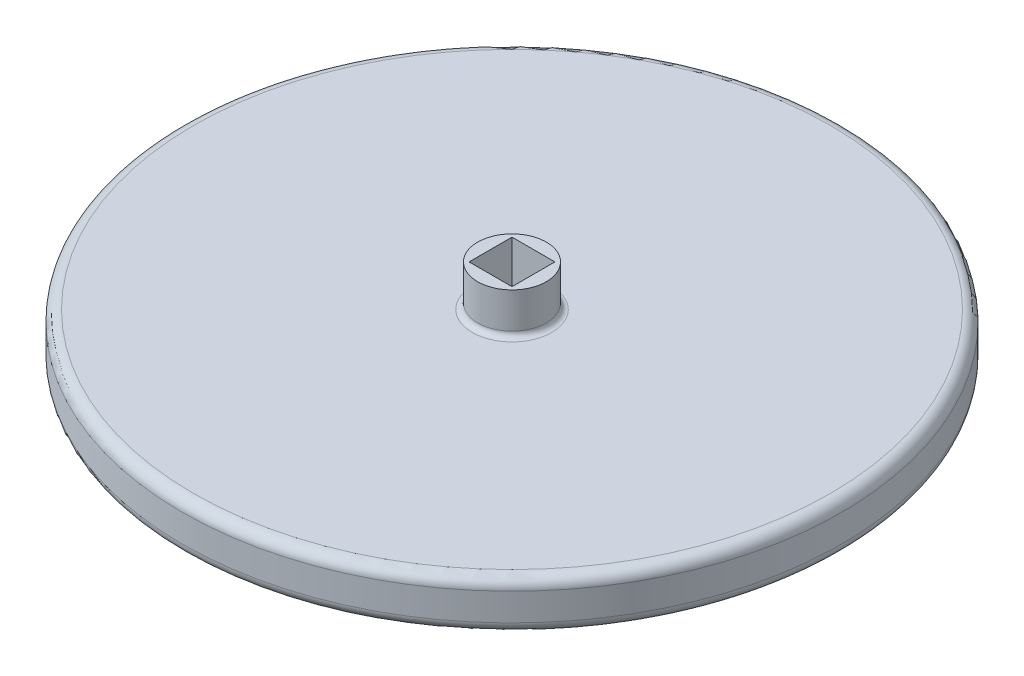
ISO-10303-21;
HEADER;
FILE_DESCRIPTION(('STEP AP214'),'2;1');
FILE_NAME('part.step','',(''),(''),'','','');
FILE_SCHEMA(('AUTOMOTIVE_DESIGN { 1 0 10303 214 1 1 1 1 }'));
ENDSEC;
DATA;
#1=APPLICATION_CONTEXT('core data for automotive mechanical design processes');
#2=APPLICATION_PROTOCOL_DEFINITION('international standard','automotive_design',2000,#1);
#3=PRODUCT_CONTEXT('',#1,'mechanical');
#4=PRODUCT('Part','Part','',(#3));
#5=PRODUCT_RELATED_PRODUCT_CATEGORY('part','',(#4));
#6=PRODUCT_DEFINITION_FORMATION('','',#4);
#7=PRODUCT_DEFINITION_CONTEXT('part definition',#1,'design');
#8=PRODUCT_DEFINITION('design','',#6,#7);
#9=PRODUCT_DEFINITION_SHAPE('','',#8);
#10=(LENGTH_UNIT() NAMED_UNIT(*) SI_UNIT(.MILLI.,.METRE.));
#11=(NAMED_UNIT(*) PLANE_ANGLE_UNIT() SI_UNIT($,.RADIAN.));
#12=(NAMED_UNIT(*) SI_UNIT($,.STERADIAN.) SOLID_ANGLE_UNIT());
#13=UNCERTAINTY_MEASURE_WITH_UNIT(LENGTH_MEASURE(1.E-05),#10,'distance_accuracy_value','');
#14=(GEOMETRIC_REPRESENTATION_CONTEXT(3) GLOBAL_UNCERTAINTY_ASSIGNED_CONTEXT((#13)) GLOBAL_UNIT_ASSIGNED_CONTEXT((#10,
#11,#12)) REPRESENTATION_CONTEXT('',''));
#15=CARTESIAN_POINT('',(0.,0.,0.));
#16=DIRECTION('',(0.,0.,1.));
#17=DIRECTION('',(1.,0.,0.));
#18=AXIS2_PLACEMENT_3D('',#15,#16,#17);
#19=CARTESIAN_POINT('',(0.,11.43,0.));
#20=DIRECTION('',(0.,-1.,0.));
#21=DIRECTION('',(0.,0.,-1.));
#22=AXIS2_PLACEMENT_3D('',#19,#20,#21);
#23=CYLINDRICAL_SURFACE('',#22,76.2);
#24=CARTESIAN_POINT('',(0.,2.54,0.));
#25=DIRECTION('',(0.,1.,0.));
#26=DIRECTION('',(0.,0.,1.));
#27=AXIS2_PLACEMENT_3D('',#24,#25,#26);
#28=CIRCLE('',#27,76.2);
#29=CARTESIAN_POINT('',(0.,2.54,76.2));
#30=VERTEX_POINT('',#29);
#31=EDGE_CURVE('E131',#30,#30,#28,.T.);
#32=ORIENTED_EDGE('',*,*,#31,.T.);
#33=EDGE_LOOP('',(#32));
#34=FACE_BOUND('',#33,.T.);
#35=CARTESIAN_POINT('',(0.,8.89,0.));
#36=DIRECTION('',(0.,1.,0.));
#37=DIRECTION('',(0.,0.,1.));
#38=AXIS2_PLACEMENT_3D('',#35,#36,#37);
#39=CIRCLE('',#38,76.2);
#40=CARTESIAN_POINT('',(0.,8.89,76.2));
#41=VERTEX_POINT('',#40);
#42=EDGE_CURVE('E128',#41,#41,#39,.F.);
#43=ORIENTED_EDGE('',*,*,#42,.T.);
#44=EDGE_LOOP('',(#43));
#45=FACE_BOUND('',#44,.T.);
#46=ADVANCED_FACE('F45',(#34,#45),#23,.T.);
#47=CARTESIAN_POINT('',(0.,11.43,0.));
#48=DIRECTION('',(0.,1.,0.));
#49=DIRECTION('',(0.,0.,1.));
#50=AXIS2_PLACEMENT_3D('',#47,#48,#49);
#51=PLANE('',#50);
#52=CARTESIAN_POINT('',(0.,11.43,0.));
#53=DIRECTION('',(0.,1.,0.));
#54=DIRECTION('',(0.,0.,1.));
#55=AXIS2_PLACEMENT_3D('',#52,#53,#54);
#56=CIRCLE('',#55,9.2075);
#57=CARTESIAN_POINT('',(0.,11.43,9.2075));
#58=VERTEX_POINT('',#57);
#59=EDGE_CURVE('E13',#58,#58,#56,.F.);
#60=ORIENTED_EDGE('',*,*,#59,.T.);
#61=EDGE_LOOP('',(#60));
#62=FACE_BOUND('',#61,.T.);
#63=CARTESIAN_POINT('',(0.,11.43,0.));
#64=DIRECTION('',(0.,1.,0.));
#65=DIRECTION('',(0.,0.,1.));
#66=AXIS2_PLACEMENT_3D('',#63,#64,#65);
#67=CIRCLE('',#66,73.66);
#68=CARTESIAN_POINT('',(0.,11.43,73.66));
#69=VERTEX_POINT('',#68);
#70=EDGE_CURVE('E137',#69,#69,#67,.T.);
#71=ORIENTED_EDGE('',*,*,#70,.T.);
#72=EDGE_LOOP('',(#71));
#73=FACE_BOUND('',#72,.T.);
#74=ADVANCED_FACE('F164',(#62,#73),#51,.T.);
#75=CARTESIAN_POINT('',(0.,0.,0.));
#76=DIRECTION('',(0.,1.,0.));
#77=DIRECTION('',(0.,0.,1.));
#78=AXIS2_PLACEMENT_3D('',#75,#76,#77);
#79=PLANE('',#78);
#80=CARTESIAN_POINT('',(0.,0.,0.));
#81=DIRECTION('',(0.,1.,0.));
#82=DIRECTION('',(0.,0.,1.));
#83=AXIS2_PLACEMENT_3D('',#80,#81,#82);
#84=CIRCLE('',#83,9.2075);
#85=CARTESIAN_POINT('',(0.,0.,9.2075));
#86=VERTEX_POINT('',#85);
#87=EDGE_CURVE('E140',#86,#86,#84,.T.);
#88=ORIENTED_EDGE('',*,*,#87,.T.);
#89=EDGE_LOOP('',(#88));
#90=FACE_BOUND('',#89,.T.);
#91=CARTESIAN_POINT('',(0.,0.,0.));
#92=DIRECTION('',(0.,1.,0.));
#93=DIRECTION('',(0.,0.,1.));
#94=AXIS2_PLACEMENT_3D('',#91,#92,#93);
#95=CIRCLE('',#94,73.66);
#96=CARTESIAN_POINT('',(0.,0.,73.66));
#97=VERTEX_POINT('',#96);
#98=EDGE_CURVE('E134',#97,#97,#95,.F.);
#99=ORIENTED_EDGE('',*,*,#98,.T.);
#100=EDGE_LOOP('',(#99));
#101=FACE_BOUND('',#100,.T.);
#102=ADVANCED_FACE('F170',(#90,#101),#79,.F.);
#103=CARTESIAN_POINT('',(0.,2.54,0.));
#104=DIRECTION('',(0.,1.,0.));
#105=DIRECTION('',(0.,0.,1.));
#106=AXIS2_PLACEMENT_3D('',#103,#104,#105);
#107=TOROIDAL_SURFACE('',#106,73.66,2.54);
#108=ORIENTED_EDGE('',*,*,#98,.F.);
#109=EDGE_LOOP('',(#108));
#110=FACE_BOUND('',#109,.T.);
#111=ORIENTED_EDGE('',*,*,#31,.F.);
#112=EDGE_LOOP('',(#111));
#113=FACE_BOUND('',#112,.T.);
#114=ADVANCED_FACE('F176',(#110,#113),#107,.T.);
#115=CARTESIAN_POINT('',(0.,8.89,0.));
#116=DIRECTION('',(0.,1.,0.));
#117=DIRECTION('',(0.,0.,1.));
#118=AXIS2_PLACEMENT_3D('',#115,#116,#117);
#119=TOROIDAL_SURFACE('',#118,73.66,2.54);
#120=ORIENTED_EDGE('',*,*,#42,.F.);
#121=EDGE_LOOP('',(#120));
#122=FACE_BOUND('',#121,.T.);
#123=ORIENTED_EDGE('',*,*,#70,.F.);
#124=EDGE_LOOP('',(#123));
#125=FACE_BOUND('',#124,.T.);
#126=ADVANCED_FACE('F179',(#122,#125),#119,.T.);
#127=CARTESIAN_POINT('',(0.,-9.525,0.));
#128=DIRECTION('',(0.,1.,0.));
#129=DIRECTION('',(0.,0.,1.));
#130=AXIS2_PLACEMENT_3D('',#127,#128,#129);
#131=PLANE('',#130);
#132=DIRECTION('',(-1.,0.,0.));
#133=VECTOR('',#132,1.);
#134=CARTESIAN_POINT('',(4.9609375,-9.525,-4.9609375));
#135=LINE('',#134,#133);
#136=CARTESIAN_POINT('',(4.9609375,-9.525,-4.9609375));
#137=VERTEX_POINT('',#136);
#138=CARTESIAN_POINT('',(-4.9609375,-9.525,-4.9609375));
#139=VERTEX_POINT('',#138);
#140=EDGE_CURVE('E115',#137,#139,#135,.T.);
#141=ORIENTED_EDGE('',*,*,#140,.T.);
#142=DIRECTION('',(0.,0.,1.));
#143=VECTOR('',#142,1.);
#144=CARTESIAN_POINT('',(-4.9609375,-9.525,4.9609375));
#145=LINE('',#144,#143);
#146=CARTESIAN_POINT('',(-4.9609375,-9.525,4.9609375));
#147=VERTEX_POINT('',#146);
#148=EDGE_CURVE('E106',#139,#147,#145,.T.);
#149=ORIENTED_EDGE('',*,*,#148,.T.);
#150=DIRECTION('',(1.,0.,0.));
#151=VECTOR('',#150,1.);
#152=CARTESIAN_POINT('',(4.9609375,-9.525,4.9609375));
#153=LINE('',#152,#151);
#154=CARTESIAN_POINT('',(4.9609375,-9.525,4.9609375));
#155=VERTEX_POINT('',#154);
#156=EDGE_CURVE('E112',#147,#155,#153,.T.);
#157=ORIENTED_EDGE('',*,*,#156,.T.);
#158=DIRECTION('',(0.,0.,-1.));
#159=VECTOR('',#158,1.);
#160=CARTESIAN_POINT('',(4.9609375,-9.525,4.9609375));
#161=LINE('',#160,#159);
#162=EDGE_CURVE('E60',#155,#137,#161,.T.);
#163=ORIENTED_EDGE('',*,*,#162,.T.);
#164=EDGE_LOOP('',(#141,#149,#157,#163));
#165=FACE_BOUND('',#164,.T.);
#166=CARTESIAN_POINT('',(0.,-9.525,0.));
#167=DIRECTION('',(0.,1.,0.));
#168=DIRECTION('',(0.,0.,1.));
#169=AXIS2_PLACEMENT_3D('',#166,#167,#168);
#170=CIRCLE('',#169,7.9375);
#171=CARTESIAN_POINT('',(0.,-9.525,7.9375));
#172=VERTEX_POINT('',#171);
#173=EDGE_CURVE('E125',#172,#172,#170,.T.);
#174=ORIENTED_EDGE('',*,*,#173,.F.);
#175=EDGE_LOOP('',(#174));
#176=FACE_BOUND('',#175,.T.);
#177=ADVANCED_FACE('F182',(#165,#176),#131,.F.);
#178=CARTESIAN_POINT('',(0.,-9.525,0.));
#179=DIRECTION('',(0.,1.,0.));
#180=DIRECTION('',(0.,0.,1.));
#181=AXIS2_PLACEMENT_3D('',#178,#179,#180);
#182=CYLINDRICAL_SURFACE('',#181,7.9375);
#183=CARTESIAN_POINT('',(0.,-1.27,0.));
#184=DIRECTION('',(0.,1.,0.));
#185=DIRECTION('',(0.,0.,1.));
#186=AXIS2_PLACEMENT_3D('',#183,#184,#185);
#187=CIRCLE('',#186,7.9375);
#188=CARTESIAN_POINT('',(0.,-1.27,7.9375));
#189=VERTEX_POINT('',#188);
#190=EDGE_CURVE('E143',#189,#189,#187,.F.);
#191=ORIENTED_EDGE('',*,*,#190,.T.);
#192=EDGE_LOOP('',(#191));
#193=FACE_BOUND('',#192,.T.);
#194=ORIENTED_EDGE('',*,*,#173,.T.);
#195=EDGE_LOOP('',(#194));
#196=FACE_BOUND('',#195,.T.);
#197=ADVANCED_FACE('F187',(#193,#196),#182,.T.);
#198=CARTESIAN_POINT('',(0.,12.7,0.));
#199=DIRECTION('',(0.,1.,0.));
#200=DIRECTION('',(0.,0.,1.));
#201=AXIS2_PLACEMENT_3D('',#198,#199,#200);
#202=CIRCLE('',#201,7.9375);
#203=CARTESIAN_POINT('',(0.,12.7,7.9375));
#204=VERTEX_POINT('',#203);
#205=EDGE_CURVE('E53',#204,#204,#202,.T.);
#206=ORIENTED_EDGE('',*,*,#205,.T.);
#207=EDGE_LOOP('',(#206));
#208=FACE_BOUND('',#207,.T.);
#209=CARTESIAN_POINT('',(0.,20.955,0.));
#210=DIRECTION('',(0.,1.,0.));
#211=DIRECTION('',(0.,0.,1.));
#212=AXIS2_PLACEMENT_3D('',#209,#210,#211);
#213=CIRCLE('',#212,7.9375);
#214=CARTESIAN_POINT('',(0.,20.955,7.9375));
#215=VERTEX_POINT('',#214);
#216=EDGE_CURVE('E120',#215,#215,#213,.T.);
#217=ORIENTED_EDGE('',*,*,#216,.F.);
#218=EDGE_LOOP('',(#217));
#219=FACE_BOUND('',#218,.T.);
#220=ADVANCED_FACE('F148',(#208,#219),#182,.T.);
#221=CARTESIAN_POINT('',(0.,20.955,0.));
#222=DIRECTION('',(0.,1.,0.));
#223=DIRECTION('',(0.,0.,1.));
#224=AXIS2_PLACEMENT_3D('',#221,#222,#223);
#225=PLANE('',#224);
#226=DIRECTION('',(0.,0.,1.));
#227=VECTOR('',#226,1.);
#228=CARTESIAN_POINT('',(-4.9609375,20.955,4.9609375));
#229=LINE('',#228,#227);
#230=CARTESIAN_POINT('',(-4.9609375,20.955,-4.9609375));
#231=VERTEX_POINT('',#230);
#232=CARTESIAN_POINT('',(-4.9609375,20.955,4.9609375));
#233=VERTEX_POINT('',#232);
#234=EDGE_CURVE('E68',#231,#233,#229,.T.);
#235=ORIENTED_EDGE('',*,*,#234,.F.);
#236=DIRECTION('',(-1.,0.,0.));
#237=VECTOR('',#236,1.);
#238=CARTESIAN_POINT('',(4.9609375,20.955,-4.9609375));
#239=LINE('',#238,#237);
#240=CARTESIAN_POINT('',(4.9609375,20.955,-4.9609375));
#241=VERTEX_POINT('',#240);
#242=EDGE_CURVE('E104',#241,#231,#239,.T.);
#243=ORIENTED_EDGE('',*,*,#242,.F.);
#244=DIRECTION('',(0.,0.,-1.));
#245=VECTOR('',#244,1.);
#246=CARTESIAN_POINT('',(4.9609375,20.955,4.9609375));
#247=LINE('',#246,#245);
#248=CARTESIAN_POINT('',(4.9609375,20.955,4.9609375));
#249=VERTEX_POINT('',#248);
#250=EDGE_CURVE('E88',#249,#241,#247,.T.);
#251=ORIENTED_EDGE('',*,*,#250,.F.);
#252=DIRECTION('',(1.,0.,0.));
#253=VECTOR('',#252,1.);
#254=CARTESIAN_POINT('',(4.9609375,20.955,4.9609375));
#255=LINE('',#254,#253);
#256=EDGE_CURVE('E97',#233,#249,#255,.T.);
#257=ORIENTED_EDGE('',*,*,#256,.F.);
#258=EDGE_LOOP('',(#235,#243,#251,#257));
#259=FACE_BOUND('',#258,.T.);
#260=ORIENTED_EDGE('',*,*,#216,.T.);
#261=EDGE_LOOP('',(#260));
#262=FACE_BOUND('',#261,.T.);
#263=ADVANCED_FACE('F101',(#259,#262),#225,.T.);
#264=CARTESIAN_POINT('',(0.,-1.27,0.));
#265=DIRECTION('',(0.,1.,0.));
#266=DIRECTION('',(0.,0.,1.));
#267=AXIS2_PLACEMENT_3D('',#264,#265,#266);
#268=TOROIDAL_SURFACE('',#267,9.2075,1.27);
#269=ORIENTED_EDGE('',*,*,#190,.F.);
#270=EDGE_LOOP('',(#269));
#271=FACE_BOUND('',#270,.T.);
#272=ORIENTED_EDGE('',*,*,#87,.F.);
#273=EDGE_LOOP('',(#272));
#274=FACE_BOUND('',#273,.T.);
#275=ADVANCED_FACE('F153',(#271,#274),#268,.F.);
#276=CARTESIAN_POINT('',(0.,12.7,0.));
#277=DIRECTION('',(0.,1.,0.));
#278=DIRECTION('',(0.,0.,1.));
#279=AXIS2_PLACEMENT_3D('',#276,#277,#278);
#280=TOROIDAL_SURFACE('',#279,9.2075,1.27);
#281=ORIENTED_EDGE('',*,*,#59,.F.);
#282=EDGE_LOOP('',(#281));
#283=FACE_BOUND('',#282,.T.);
#284=ORIENTED_EDGE('',*,*,#205,.F.);
#285=EDGE_LOOP('',(#284));
#286=FACE_BOUND('',#285,.T.);
#287=ADVANCED_FACE('F47',(#283,#286),#280,.F.);
#288=CARTESIAN_POINT('',(-4.9609375,-9.525,4.9609375));
#289=DIRECTION('',(-1.,0.,0.));
#290=DIRECTION('',(0.,0.,1.));
#291=AXIS2_PLACEMENT_3D('',#288,#289,#290);
#292=PLANE('',#291);
#293=DIRECTION('',(0.,1.,0.));
#294=VECTOR('',#293,1.);
#295=CARTESIAN_POINT('',(-4.9609375,-9.525,4.9609375));
#296=LINE('',#295,#294);
#297=EDGE_CURVE('E94',#147,#233,#296,.T.);
#298=ORIENTED_EDGE('',*,*,#297,.F.);
#299=ORIENTED_EDGE('',*,*,#148,.F.);
#300=DIRECTION('',(0.,1.,0.));
#301=VECTOR('',#300,1.);
#302=CARTESIAN_POINT('',(-4.9609375,-9.525,-4.9609375));
#303=LINE('',#302,#301);
#304=EDGE_CURVE('E118',#139,#231,#303,.T.);
#305=ORIENTED_EDGE('',*,*,#304,.T.);
#306=ORIENTED_EDGE('',*,*,#234,.T.);
#307=EDGE_LOOP('',(#298,#299,#305,#306));
#308=FACE_BOUND('',#307,.T.);
#309=ADVANCED_FACE('F152',(#308),#292,.F.);
#310=CARTESIAN_POINT('',(4.9609375,-9.525,-4.9609375));
#311=DIRECTION('',(0.,0.,-1.));
#312=DIRECTION('',(-1.,0.,0.));
#313=AXIS2_PLACEMENT_3D('',#310,#311,#312);
#314=PLANE('',#313);
#315=ORIENTED_EDGE('',*,*,#304,.F.);
#316=ORIENTED_EDGE('',*,*,#140,.F.);
#317=DIRECTION('',(0.,1.,0.));
#318=VECTOR('',#317,1.);
#319=CARTESIAN_POINT('',(4.9609375,-9.525,-4.9609375));
#320=LINE('',#319,#318);
#321=EDGE_CURVE('E93',#137,#241,#320,.T.);
#322=ORIENTED_EDGE('',*,*,#321,.T.);
#323=ORIENTED_EDGE('',*,*,#242,.T.);
#324=EDGE_LOOP('',(#315,#316,#322,#323));
#325=FACE_BOUND('',#324,.T.);
#326=ADVANCED_FACE('F159',(#325),#314,.F.);
#327=CARTESIAN_POINT('',(4.9609375,-9.525,4.9609375));
#328=DIRECTION('',(1.,0.,0.));
#329=DIRECTION('',(0.,0.,-1.));
#330=AXIS2_PLACEMENT_3D('',#327,#328,#329);
#331=PLANE('',#330);
#332=ORIENTED_EDGE('',*,*,#321,.F.);
#333=ORIENTED_EDGE('',*,*,#162,.F.);
#334=DIRECTION('',(0.,1.,0.));
#335=VECTOR('',#334,1.);
#336=CARTESIAN_POINT('',(4.9609375,-9.525,4.9609375));
#337=LINE('',#336,#335);
#338=EDGE_CURVE('E84',#155,#249,#337,.T.);
#339=ORIENTED_EDGE('',*,*,#338,.T.);
#340=ORIENTED_EDGE('',*,*,#250,.T.);
#341=EDGE_LOOP('',(#332,#333,#339,#340));
#342=FACE_BOUND('',#341,.T.);
#343=ADVANCED_FACE('F86',(#342),#331,.F.);
#344=CARTESIAN_POINT('',(4.9609375,-9.525,4.9609375));
#345=DIRECTION('',(0.,0.,1.));
#346=DIRECTION('',(1.,0.,0.));
#347=AXIS2_PLACEMENT_3D('',#344,#345,#346);
#348=PLANE('',#347);
#349=ORIENTED_EDGE('',*,*,#338,.F.);
#350=ORIENTED_EDGE('',*,*,#156,.F.);
#351=ORIENTED_EDGE('',*,*,#297,.T.);
#352=ORIENTED_EDGE('',*,*,#256,.T.);
#353=EDGE_LOOP('',(#349,#350,#351,#352));
#354=FACE_BOUND('',#353,.T.);
#355=ADVANCED_FACE('F98',(#354),#348,.F.);
#356=CLOSED_SHELL('',(#46,#74,#102,#114,#126,#177,#197,#220,#263,#275,#287,#309,#326,#343,#355));
#357=MANIFOLD_SOLID_BREP('B2',#356);
#358=ADVANCED_BREP_SHAPE_REPRESENTATION('',(#18,#357),#14);
#359=SHAPE_DEFINITION_REPRESENTATION(#9,#358);
ENDSEC;
END-ISO-10303-21;
